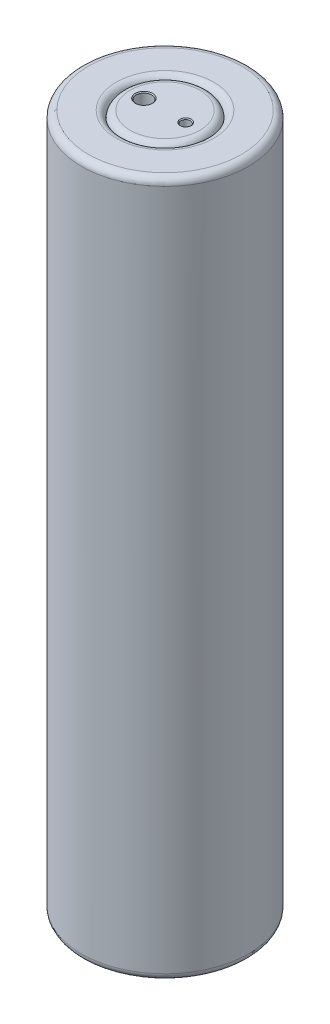
ISO-10303-21;
HEADER;
FILE_DESCRIPTION(('STEP AP214'),'2;1');
FILE_NAME('part.step','',(''),(''),'','','');
FILE_SCHEMA(('AUTOMOTIVE_DESIGN { 1 0 10303 214 1 1 1 1 }'));
ENDSEC;
DATA;
#1=APPLICATION_CONTEXT('core data for automotive mechanical design processes');
#2=APPLICATION_PROTOCOL_DEFINITION('international standard','automotive_design',2000,#1);
#3=PRODUCT_CONTEXT('',#1,'mechanical');
#4=PRODUCT('Part','Part','',(#3));
#5=PRODUCT_RELATED_PRODUCT_CATEGORY('part','',(#4));
#6=PRODUCT_DEFINITION_FORMATION('','',#4);
#7=PRODUCT_DEFINITION_CONTEXT('part definition',#1,'design');
#8=PRODUCT_DEFINITION('design','',#6,#7);
#9=PRODUCT_DEFINITION_SHAPE('','',#8);
#10=(LENGTH_UNIT() NAMED_UNIT(*) SI_UNIT(.MILLI.,.METRE.));
#11=(NAMED_UNIT(*) PLANE_ANGLE_UNIT() SI_UNIT($,.RADIAN.));
#12=(NAMED_UNIT(*) SI_UNIT($,.STERADIAN.) SOLID_ANGLE_UNIT());
#13=UNCERTAINTY_MEASURE_WITH_UNIT(LENGTH_MEASURE(1.E-05),#10,'distance_accuracy_value','');
#14=(GEOMETRIC_REPRESENTATION_CONTEXT(3) GLOBAL_UNCERTAINTY_ASSIGNED_CONTEXT((#13)) GLOBAL_UNIT_ASSIGNED_CONTEXT((#10,
#11,#12)) REPRESENTATION_CONTEXT('',''));
#15=CARTESIAN_POINT('',(0.,0.,0.));
#16=DIRECTION('',(0.,0.,1.));
#17=DIRECTION('',(1.,0.,0.));
#18=AXIS2_PLACEMENT_3D('',#15,#16,#17);
#19=CARTESIAN_POINT('',(0.,-472.667682926829,-12.834024954833));
#20=DIRECTION('',(0.,-1.,0.));
#21=DIRECTION('',(0.,0.,-1.));
#22=AXIS2_PLACEMENT_3D('',#19,#20,#21);
#23=CYLINDRICAL_SURFACE('',#22,55.9999999999999);
#24=CARTESIAN_POINT('',(0.,-467.667682926829,-12.8340249548329));
#25=DIRECTION('',(0.,-1.,0.));
#26=DIRECTION('',(0.,0.,-1.));
#27=AXIS2_PLACEMENT_3D('',#24,#25,#26);
#28=CIRCLE('',#27,56.);
#29=CARTESIAN_POINT('',(0.,-467.667682926829,-68.8340249548329));
#30=VERTEX_POINT('',#29);
#31=EDGE_CURVE('E90',#30,#30,#28,.T.);
#32=ORIENTED_EDGE('',*,*,#31,.T.);
#33=EDGE_LOOP('',(#32));
#34=FACE_BOUND('',#33,.T.);
#35=CARTESIAN_POINT('',(0.,12.3323170731707,-12.8340249548329));
#36=DIRECTION('',(0.,-1.,0.));
#37=DIRECTION('',(0.,0.,-1.));
#38=AXIS2_PLACEMENT_3D('',#35,#36,#37);
#39=CIRCLE('',#38,55.9999999999999);
#40=CARTESIAN_POINT('',(0.,12.3323170731707,-68.8340249548328));
#41=VERTEX_POINT('',#40);
#42=EDGE_CURVE('E81',#41,#41,#39,.T.);
#43=ORIENTED_EDGE('',*,*,#42,.F.);
#44=EDGE_LOOP('',(#43));
#45=FACE_BOUND('',#44,.T.);
#46=ADVANCED_FACE('F37',(#34,#45),#23,.F.);
#47=CARTESIAN_POINT('',(0.,12.3323170731707,43.1659750451671));
#48=DIRECTION('',(0.,-1.,0.));
#49=DIRECTION('',(0.,0.,-1.));
#50=AXIS2_PLACEMENT_3D('',#47,#48,#49);
#51=PLANE('',#50);
#52=ORIENTED_EDGE('',*,*,#42,.T.);
#53=EDGE_LOOP('',(#52));
#54=FACE_BOUND('',#53,.T.);
#55=CARTESIAN_POINT('',(0.,12.3323170731707,-12.8340249548329));
#56=DIRECTION('',(0.,-1.,0.));
#57=DIRECTION('',(0.,0.,-1.));
#58=AXIS2_PLACEMENT_3D('',#55,#56,#57);
#59=CIRCLE('',#58,34.);
#60=CARTESIAN_POINT('',(0.,12.3323170731707,-46.8340249548329));
#61=VERTEX_POINT('',#60);
#62=EDGE_CURVE('E84',#61,#61,#59,.T.);
#63=ORIENTED_EDGE('',*,*,#62,.F.);
#64=EDGE_LOOP('',(#63));
#65=FACE_BOUND('',#64,.T.);
#66=ADVANCED_FACE('F141',(#54,#65),#51,.T.);
#67=CARTESIAN_POINT('',(0.,-472.667682926829,-12.834024954833));
#68=DIRECTION('',(0.,-1.,0.));
#69=DIRECTION('',(0.,0.,-1.));
#70=AXIS2_PLACEMENT_3D('',#67,#68,#69);
#71=CYLINDRICAL_SURFACE('',#70,34.);
#72=ORIENTED_EDGE('',*,*,#62,.T.);
#73=EDGE_LOOP('',(#72));
#74=FACE_BOUND('',#73,.T.);
#75=CARTESIAN_POINT('',(0.,-467.667682926829,-12.8340249548329));
#76=DIRECTION('',(0.,-1.,0.));
#77=DIRECTION('',(0.,0.,-1.));
#78=AXIS2_PLACEMENT_3D('',#75,#76,#77);
#79=CIRCLE('',#78,34.);
#80=CARTESIAN_POINT('',(0.,-467.667682926829,-46.834024954833));
#81=VERTEX_POINT('',#80);
#82=EDGE_CURVE('E87',#81,#81,#79,.T.);
#83=ORIENTED_EDGE('',*,*,#82,.F.);
#84=EDGE_LOOP('',(#83));
#85=FACE_BOUND('',#84,.T.);
#86=ADVANCED_FACE('F147',(#74,#85),#71,.T.);
#87=CARTESIAN_POINT('',(0.,-467.667682926829,43.165975045167));
#88=DIRECTION('',(0.,1.,0.));
#89=DIRECTION('',(0.,0.,1.));
#90=AXIS2_PLACEMENT_3D('',#87,#88,#89);
#91=PLANE('',#90);
#92=CARTESIAN_POINT('',(-44.9995193019944,-467.667682926829,-13.042021564013));
#93=DIRECTION('',(0.,1.,0.));
#94=DIRECTION('',(0.,0.,1.));
#95=AXIS2_PLACEMENT_3D('',#92,#93,#94);
#96=CIRCLE('',#95,6.74624);
#97=CARTESIAN_POINT('',(-44.9995193019944,-467.667682926829,-6.29578156401303));
#98=VERTEX_POINT('',#97);
#99=EDGE_CURVE('E111',#98,#98,#96,.T.);
#100=ORIENTED_EDGE('',*,*,#99,.F.);
#101=EDGE_LOOP('',(#100));
#102=FACE_BOUND('',#101,.T.);
#103=ORIENTED_EDGE('',*,*,#82,.T.);
#104=EDGE_LOOP('',(#103));
#105=FACE_BOUND('',#104,.T.);
#106=ORIENTED_EDGE('',*,*,#31,.F.);
#107=EDGE_LOOP('',(#106));
#108=FACE_BOUND('',#107,.T.);
#109=ADVANCED_FACE('F230',(#102,#105,#108),#91,.T.);
#110=CARTESIAN_POINT('',(-44.9995193019944,-477.667682926829,-13.042021564013));
#111=DIRECTION('',(0.,-1.,0.));
#112=DIRECTION('',(0.,0.,-1.));
#113=AXIS2_PLACEMENT_3D('',#110,#111,#112);
#114=CYLINDRICAL_SURFACE('',#113,6.74624);
#115=CARTESIAN_POINT('',(-44.9995193019944,-477.032682926829,-13.042021564013));
#116=DIRECTION('',(0.,-1.,0.));
#117=DIRECTION('',(0.,0.,-1.));
#118=AXIS2_PLACEMENT_3D('',#115,#116,#117);
#119=CIRCLE('',#118,6.74624);
#120=CARTESIAN_POINT('',(-44.9995193019944,-477.032682926829,-19.788261564013));
#121=VERTEX_POINT('',#120);
#122=EDGE_CURVE('E114',#121,#121,#119,.T.);
#123=ORIENTED_EDGE('',*,*,#122,.T.);
#124=EDGE_LOOP('',(#123));
#125=FACE_BOUND('',#124,.T.);
#126=ORIENTED_EDGE('',*,*,#99,.T.);
#127=EDGE_LOOP('',(#126));
#128=FACE_BOUND('',#127,.T.);
#129=ADVANCED_FACE('F134',(#125,#128),#114,.F.);
#130=CARTESIAN_POINT('',(-44.9995193019944,-477.667682926829,-13.042021564013));
#131=DIRECTION('',(0.,-1.,0.));
#132=DIRECTION('',(0.,0.,-1.));
#133=AXIS2_PLACEMENT_3D('',#130,#131,#132);
#134=CONICAL_SURFACE('',#133,7.38124,0.785398163397448);
#135=ORIENTED_EDGE('',*,*,#122,.F.);
#136=EDGE_LOOP('',(#135));
#137=FACE_BOUND('',#136,.T.);
#138=CARTESIAN_POINT('',(-44.9995193019944,-477.667682926829,-13.042021564013));
#139=DIRECTION('',(0.,-1.,0.));
#140=DIRECTION('',(0.,0.,-1.));
#141=AXIS2_PLACEMENT_3D('',#138,#139,#140);
#142=CIRCLE('',#141,7.38124);
#143=CARTESIAN_POINT('',(-44.9995193019944,-477.667682926829,-20.423261564013));
#144=VERTEX_POINT('',#143);
#145=EDGE_CURVE('E117',#144,#144,#142,.T.);
#146=ORIENTED_EDGE('',*,*,#145,.T.);
#147=EDGE_LOOP('',(#146));
#148=FACE_BOUND('',#147,.T.);
#149=ADVANCED_FACE('F121',(#137,#148),#134,.F.);
#150=CARTESIAN_POINT('',(0.,-477.667682926829,47.165975045167));
#151=DIRECTION('',(0.,1.,0.));
#152=DIRECTION('',(0.,0.,1.));
#153=AXIS2_PLACEMENT_3D('',#150,#151,#152);
#154=PLANE('',#153);
#155=CARTESIAN_POINT('',(0.,-477.667682926829,-12.834024954833));
#156=DIRECTION('',(0.,1.,0.));
#157=DIRECTION('',(0.,0.,1.));
#158=AXIS2_PLACEMENT_3D('',#155,#156,#157);
#159=CIRCLE('',#158,35.);
#160=CARTESIAN_POINT('',(0.,-477.667682926829,22.165975045167));
#161=VERTEX_POINT('',#160);
#162=EDGE_CURVE('E44',#161,#161,#159,.T.);
#163=ORIENTED_EDGE('',*,*,#162,.T.);
#164=EDGE_LOOP('',(#163));
#165=FACE_BOUND('',#164,.T.);
#166=CARTESIAN_POINT('',(0.,-477.667682926829,-12.834024954833));
#167=DIRECTION('',(0.,1.,0.));
#168=DIRECTION('',(0.,0.,1.));
#169=AXIS2_PLACEMENT_3D('',#166,#167,#168);
#170=CIRCLE('',#169,54.9999999999999);
#171=CARTESIAN_POINT('',(0.,-477.667682926829,42.165975045167));
#172=VERTEX_POINT('',#171);
#173=EDGE_CURVE('E48',#172,#172,#170,.F.);
#174=ORIENTED_EDGE('',*,*,#173,.T.);
#175=EDGE_LOOP('',(#174));
#176=FACE_BOUND('',#175,.T.);
#177=ORIENTED_EDGE('',*,*,#145,.F.);
#178=EDGE_LOOP('',(#177));
#179=FACE_BOUND('',#178,.T.);
#180=ADVANCED_FACE('F123',(#165,#176,#179),#154,.F.);
#181=CARTESIAN_POINT('',(0.,-467.667682926829,-12.8340249548329));
#182=DIRECTION('',(0.,1.,0.));
#183=DIRECTION('',(0.,0.,1.));
#184=AXIS2_PLACEMENT_3D('',#181,#182,#183);
#185=PLANE('',#184);
#186=CARTESIAN_POINT('',(0.,-467.667682926829,-12.8340249548329));
#187=DIRECTION('',(0.,1.,0.));
#188=DIRECTION('',(0.,0.,1.));
#189=AXIS2_PLACEMENT_3D('',#186,#187,#188);
#190=CIRCLE('',#189,26.);
#191=CARTESIAN_POINT('',(0.,-467.667682926829,13.165975045167));
#192=VERTEX_POINT('',#191);
#193=EDGE_CURVE('E75',#192,#192,#190,.T.);
#194=ORIENTED_EDGE('',*,*,#193,.T.);
#195=EDGE_LOOP('',(#194));
#196=FACE_BOUND('',#195,.T.);
#197=ADVANCED_FACE('F125',(#196),#185,.T.);
#198=CARTESIAN_POINT('',(0.,-467.667682926829,-12.8340249548329));
#199=DIRECTION('',(0.,1.,0.));
#200=DIRECTION('',(0.,0.,1.));
#201=AXIS2_PLACEMENT_3D('',#198,#199,#200);
#202=CYLINDRICAL_SURFACE('',#201,26.);
#203=CARTESIAN_POINT('',(0.,12.3323170731707,-12.8340249548329));
#204=DIRECTION('',(0.,1.,0.));
#205=DIRECTION('',(0.,0.,1.));
#206=AXIS2_PLACEMENT_3D('',#203,#204,#205);
#207=CIRCLE('',#206,26.);
#208=CARTESIAN_POINT('',(0.,12.3323170731707,13.1659750451671));
#209=VERTEX_POINT('',#208);
#210=EDGE_CURVE('E78',#209,#209,#207,.T.);
#211=ORIENTED_EDGE('',*,*,#210,.T.);
#212=EDGE_LOOP('',(#211));
#213=FACE_BOUND('',#212,.T.);
#214=ORIENTED_EDGE('',*,*,#193,.F.);
#215=EDGE_LOOP('',(#214));
#216=FACE_BOUND('',#215,.T.);
#217=ADVANCED_FACE('F131',(#213,#216),#202,.F.);
#218=CARTESIAN_POINT('',(0.,12.3323170731707,-12.8340249548329));
#219=DIRECTION('',(0.,-1.,0.));
#220=DIRECTION('',(0.,0.,-1.));
#221=AXIS2_PLACEMENT_3D('',#218,#219,#220);
#222=PLANE('',#221);
#223=CARTESIAN_POINT('',(14.9990655702707,12.3323170731707,-12.6665973026403));
#224=DIRECTION('',(0.,-1.,0.));
#225=DIRECTION('',(0.,0.,-1.));
#226=AXIS2_PLACEMENT_3D('',#223,#224,#225);
#227=CIRCLE('',#226,3.3782);
#228=CARTESIAN_POINT('',(14.9990655702707,12.3323170731707,-16.0447973026403));
#229=VERTEX_POINT('',#228);
#230=EDGE_CURVE('E102',#229,#229,#227,.T.);
#231=ORIENTED_EDGE('',*,*,#230,.F.);
#232=EDGE_LOOP('',(#231));
#233=FACE_BOUND('',#232,.T.);
#234=CARTESIAN_POINT('',(-14.9989517782276,12.3323170731707,-12.656696010766));
#235=DIRECTION('',(0.,-1.,0.));
#236=DIRECTION('',(0.,0.,-1.));
#237=AXIS2_PLACEMENT_3D('',#234,#235,#236);
#238=CIRCLE('',#237,5.5626);
#239=CARTESIAN_POINT('',(-14.9989517782276,12.3323170731707,-18.219296010766));
#240=VERTEX_POINT('',#239);
#241=EDGE_CURVE('E93',#240,#240,#238,.T.);
#242=ORIENTED_EDGE('',*,*,#241,.F.);
#243=EDGE_LOOP('',(#242));
#244=FACE_BOUND('',#243,.T.);
#245=ORIENTED_EDGE('',*,*,#210,.F.);
#246=EDGE_LOOP('',(#245));
#247=FACE_BOUND('',#246,.T.);
#248=ADVANCED_FACE('F192',(#233,#244,#247),#222,.T.);
#249=CARTESIAN_POINT('',(-14.9989517782276,22.3323170731707,-12.656696010766));
#250=DIRECTION('',(0.,1.,0.));
#251=DIRECTION('',(0.,0.,1.));
#252=AXIS2_PLACEMENT_3D('',#249,#250,#251);
#253=CYLINDRICAL_SURFACE('',#252,5.5626);
#254=CARTESIAN_POINT('',(-14.9989517782276,21.6973170731707,-12.656696010766));
#255=DIRECTION('',(0.,1.,0.));
#256=DIRECTION('',(0.,0.,1.));
#257=AXIS2_PLACEMENT_3D('',#254,#255,#256);
#258=CIRCLE('',#257,5.5626);
#259=CARTESIAN_POINT('',(-14.9989517782276,21.6973170731707,-7.09409601076597));
#260=VERTEX_POINT('',#259);
#261=EDGE_CURVE('E96',#260,#260,#258,.T.);
#262=ORIENTED_EDGE('',*,*,#261,.T.);
#263=EDGE_LOOP('',(#262));
#264=FACE_BOUND('',#263,.T.);
#265=ORIENTED_EDGE('',*,*,#241,.T.);
#266=EDGE_LOOP('',(#265));
#267=FACE_BOUND('',#266,.T.);
#268=ADVANCED_FACE('F196',(#264,#267),#253,.F.);
#269=CARTESIAN_POINT('',(-14.9989517782276,22.3323170731707,-12.656696010766));
#270=DIRECTION('',(0.,1.,0.));
#271=DIRECTION('',(0.,0.,1.));
#272=AXIS2_PLACEMENT_3D('',#269,#270,#271);
#273=CONICAL_SURFACE('',#272,6.1976,0.785398163397451);
#274=ORIENTED_EDGE('',*,*,#261,.F.);
#275=EDGE_LOOP('',(#274));
#276=FACE_BOUND('',#275,.T.);
#277=CARTESIAN_POINT('',(-14.9989517782276,22.3323170731707,-12.656696010766));
#278=DIRECTION('',(0.,1.,0.));
#279=DIRECTION('',(0.,0.,1.));
#280=AXIS2_PLACEMENT_3D('',#277,#278,#279);
#281=CIRCLE('',#280,6.1976);
#282=CARTESIAN_POINT('',(-14.9989517782276,22.3323170731707,-6.45909601076597));
#283=VERTEX_POINT('',#282);
#284=EDGE_CURVE('E99',#283,#283,#281,.T.);
#285=ORIENTED_EDGE('',*,*,#284,.T.);
#286=EDGE_LOOP('',(#285));
#287=FACE_BOUND('',#286,.T.);
#288=ADVANCED_FACE('F199',(#276,#287),#273,.F.);
#289=CARTESIAN_POINT('',(0.,22.3323170731707,17.1659750451671));
#290=DIRECTION('',(0.,1.,0.));
#291=DIRECTION('',(0.,0.,1.));
#292=AXIS2_PLACEMENT_3D('',#289,#290,#291);
#293=PLANE('',#292);
#294=CARTESIAN_POINT('',(14.9990655702707,22.3323170731707,-12.6665973026403));
#295=DIRECTION('',(0.,1.,0.));
#296=DIRECTION('',(0.,0.,1.));
#297=AXIS2_PLACEMENT_3D('',#294,#295,#296);
#298=CIRCLE('',#297,4.0132);
#299=CARTESIAN_POINT('',(14.9990655702707,22.3323170731707,-8.65339730264028));
#300=VERTEX_POINT('',#299);
#301=EDGE_CURVE('E108',#300,#300,#298,.T.);
#302=ORIENTED_EDGE('',*,*,#301,.F.);
#303=EDGE_LOOP('',(#302));
#304=FACE_BOUND('',#303,.T.);
#305=ORIENTED_EDGE('',*,*,#284,.F.);
#306=EDGE_LOOP('',(#305));
#307=FACE_BOUND('',#306,.T.);
#308=CARTESIAN_POINT('',(0.,22.3323170731707,-12.8340249548329));
#309=DIRECTION('',(0.,1.,0.));
#310=DIRECTION('',(0.,0.,1.));
#311=AXIS2_PLACEMENT_3D('',#308,#309,#310);
#312=CIRCLE('',#311,25.);
#313=CARTESIAN_POINT('',(0.,22.3323170731707,12.1659750451671));
#314=VERTEX_POINT('',#313);
#315=EDGE_CURVE('E72',#314,#314,#312,.T.);
#316=ORIENTED_EDGE('',*,*,#315,.T.);
#317=EDGE_LOOP('',(#316));
#318=FACE_BOUND('',#317,.T.);
#319=ADVANCED_FACE('F187',(#304,#307,#318),#293,.T.);
#320=CARTESIAN_POINT('',(0.,17.3323170731707,-12.8340249548329));
#321=DIRECTION('',(0.,1.,0.));
#322=DIRECTION('',(0.,0.,1.));
#323=AXIS2_PLACEMENT_3D('',#320,#321,#322);
#324=TOROIDAL_SURFACE('',#323,25.,5.);
#325=CARTESIAN_POINT('',(0.,17.3323170731707,-12.8340249548329));
#326=DIRECTION('',(0.,1.,0.));
#327=DIRECTION('',(0.,0.,1.));
#328=AXIS2_PLACEMENT_3D('',#325,#326,#327);
#329=CIRCLE('',#328,30.);
#330=CARTESIAN_POINT('',(0.,17.3323170731707,17.1659750451671));
#331=VERTEX_POINT('',#330);
#332=EDGE_CURVE('E69',#331,#331,#329,.F.);
#333=ORIENTED_EDGE('',*,*,#332,.F.);
#334=EDGE_LOOP('',(#333));
#335=FACE_BOUND('',#334,.T.);
#336=ORIENTED_EDGE('',*,*,#315,.F.);
#337=EDGE_LOOP('',(#336));
#338=FACE_BOUND('',#337,.T.);
#339=ADVANCED_FACE('F164',(#335,#338),#324,.T.);
#340=CARTESIAN_POINT('',(0.,-472.667682926829,-12.834024954833));
#341=DIRECTION('',(0.,-1.,0.));
#342=DIRECTION('',(0.,0.,-1.));
#343=AXIS2_PLACEMENT_3D('',#340,#341,#342);
#344=CYLINDRICAL_SURFACE('',#343,59.9999999999999);
#345=CARTESIAN_POINT('',(0.,-472.667682926829,-12.834024954833));
#346=DIRECTION('',(0.,1.,0.));
#347=DIRECTION('',(0.,0.,1.));
#348=AXIS2_PLACEMENT_3D('',#345,#346,#347);
#349=CIRCLE('',#348,59.9999999999999);
#350=CARTESIAN_POINT('',(0.,-472.667682926829,47.165975045167));
#351=VERTEX_POINT('',#350);
#352=EDGE_CURVE('E10',#351,#351,#349,.T.);
#353=ORIENTED_EDGE('',*,*,#352,.T.);
#354=EDGE_LOOP('',(#353));
#355=FACE_BOUND('',#354,.T.);
#356=CARTESIAN_POINT('',(0.,17.3323170731707,-12.8340249548329));
#357=DIRECTION('',(0.,-1.,0.));
#358=DIRECTION('',(0.,0.,-1.));
#359=AXIS2_PLACEMENT_3D('',#356,#357,#358);
#360=CIRCLE('',#359,59.9999999999999);
#361=CARTESIAN_POINT('',(0.,17.3323170731707,-72.8340249548328));
#362=VERTEX_POINT('',#361);
#363=EDGE_CURVE('E60',#362,#362,#360,.T.);
#364=ORIENTED_EDGE('',*,*,#363,.T.);
#365=EDGE_LOOP('',(#364));
#366=FACE_BOUND('',#365,.T.);
#367=ADVANCED_FACE('F155',(#355,#366),#344,.T.);
#368=CARTESIAN_POINT('',(0.,22.3323170731707,47.1659750451671));
#369=DIRECTION('',(0.,-1.,0.));
#370=DIRECTION('',(0.,0.,-1.));
#371=AXIS2_PLACEMENT_3D('',#368,#369,#370);
#372=PLANE('',#371);
#373=CARTESIAN_POINT('',(0.,22.3323170731707,-12.8340249548329));
#374=DIRECTION('',(0.,-1.,0.));
#375=DIRECTION('',(0.,0.,-1.));
#376=AXIS2_PLACEMENT_3D('',#373,#374,#375);
#377=CIRCLE('',#376,54.9999999999999);
#378=CARTESIAN_POINT('',(0.,22.3323170731707,-67.8340249548328));
#379=VERTEX_POINT('',#378);
#380=EDGE_CURVE('E52',#379,#379,#377,.F.);
#381=ORIENTED_EDGE('',*,*,#380,.T.);
#382=EDGE_LOOP('',(#381));
#383=FACE_BOUND('',#382,.T.);
#384=CARTESIAN_POINT('',(0.,22.3323170731707,-12.8340249548329));
#385=DIRECTION('',(0.,-1.,0.));
#386=DIRECTION('',(0.,0.,-1.));
#387=AXIS2_PLACEMENT_3D('',#384,#385,#386);
#388=CIRCLE('',#387,35.);
#389=CARTESIAN_POINT('',(0.,22.3323170731707,-47.8340249548329));
#390=VERTEX_POINT('',#389);
#391=EDGE_CURVE('E57',#390,#390,#388,.T.);
#392=ORIENTED_EDGE('',*,*,#391,.T.);
#393=EDGE_LOOP('',(#392));
#394=FACE_BOUND('',#393,.T.);
#395=ADVANCED_FACE('F152',(#383,#394),#372,.F.);
#396=CARTESIAN_POINT('',(0.,-477.667682926829,17.165975045167));
#397=DIRECTION('',(0.,-1.,0.));
#398=DIRECTION('',(0.,0.,-1.));
#399=AXIS2_PLACEMENT_3D('',#396,#397,#398);
#400=PLANE('',#399);
#401=CARTESIAN_POINT('',(0.,-477.667682926829,-12.8340249548329));
#402=DIRECTION('',(0.,-1.,0.));
#403=DIRECTION('',(0.,0.,-1.));
#404=AXIS2_PLACEMENT_3D('',#401,#402,#403);
#405=CIRCLE('',#404,25.);
#406=CARTESIAN_POINT('',(0.,-477.667682926829,-37.8340249548329));
#407=VERTEX_POINT('',#406);
#408=EDGE_CURVE('E63',#407,#407,#405,.T.);
#409=ORIENTED_EDGE('',*,*,#408,.T.);
#410=EDGE_LOOP('',(#409));
#411=FACE_BOUND('',#410,.T.);
#412=ADVANCED_FACE('F154',(#411),#400,.T.);
#413=CARTESIAN_POINT('',(0.,-472.667682926829,-12.8340249548329));
#414=DIRECTION('',(0.,-1.,0.));
#415=DIRECTION('',(0.,0.,-1.));
#416=AXIS2_PLACEMENT_3D('',#413,#414,#415);
#417=TOROIDAL_SURFACE('',#416,25.,5.);
#418=ORIENTED_EDGE('',*,*,#408,.F.);
#419=EDGE_LOOP('',(#418));
#420=FACE_BOUND('',#419,.T.);
#421=CARTESIAN_POINT('',(0.,-472.667682926829,-12.8340249548329));
#422=DIRECTION('',(0.,-1.,0.));
#423=DIRECTION('',(0.,0.,-1.));
#424=AXIS2_PLACEMENT_3D('',#421,#422,#423);
#425=CIRCLE('',#424,30.);
#426=CARTESIAN_POINT('',(0.,-472.667682926829,-42.8340249548329));
#427=VERTEX_POINT('',#426);
#428=EDGE_CURVE('E66',#427,#427,#425,.F.);
#429=ORIENTED_EDGE('',*,*,#428,.F.);
#430=EDGE_LOOP('',(#429));
#431=FACE_BOUND('',#430,.T.);
#432=ADVANCED_FACE('F161',(#420,#431),#417,.T.);
#433=CARTESIAN_POINT('',(0.,17.3323170731707,-12.8340249548329));
#434=DIRECTION('',(0.,-1.,0.));
#435=DIRECTION('',(0.,0.,-1.));
#436=AXIS2_PLACEMENT_3D('',#433,#434,#435);
#437=TOROIDAL_SURFACE('',#436,54.9999999999999,5.);
#438=ORIENTED_EDGE('',*,*,#380,.F.);
#439=EDGE_LOOP('',(#438));
#440=FACE_BOUND('',#439,.T.);
#441=ORIENTED_EDGE('',*,*,#363,.F.);
#442=EDGE_LOOP('',(#441));
#443=FACE_BOUND('',#442,.T.);
#444=ADVANCED_FACE('F172',(#440,#443),#437,.T.);
#445=CARTESIAN_POINT('',(0.,17.3323170731707,-12.8340249548329));
#446=DIRECTION('',(0.,-1.,0.));
#447=DIRECTION('',(0.,0.,-1.));
#448=AXIS2_PLACEMENT_3D('',#445,#446,#447);
#449=TOROIDAL_SURFACE('',#448,35.,5.);
#450=ORIENTED_EDGE('',*,*,#332,.T.);
#451=EDGE_LOOP('',(#450));
#452=FACE_BOUND('',#451,.T.);
#453=ORIENTED_EDGE('',*,*,#391,.F.);
#454=EDGE_LOOP('',(#453));
#455=FACE_BOUND('',#454,.T.);
#456=ADVANCED_FACE('F169',(#452,#455),#449,.T.);
#457=CARTESIAN_POINT('',(0.,-472.667682926829,-12.834024954833));
#458=DIRECTION('',(0.,1.,0.));
#459=DIRECTION('',(0.,0.,1.));
#460=AXIS2_PLACEMENT_3D('',#457,#458,#459);
#461=TOROIDAL_SURFACE('',#460,35.,5.);
#462=ORIENTED_EDGE('',*,*,#162,.F.);
#463=EDGE_LOOP('',(#462));
#464=FACE_BOUND('',#463,.T.);
#465=ORIENTED_EDGE('',*,*,#428,.T.);
#466=EDGE_LOOP('',(#465));
#467=FACE_BOUND('',#466,.T.);
#468=ADVANCED_FACE('F171',(#464,#467),#461,.T.);
#469=CARTESIAN_POINT('',(0.,-472.667682926829,-12.834024954833));
#470=DIRECTION('',(0.,1.,0.));
#471=DIRECTION('',(0.,0.,1.));
#472=AXIS2_PLACEMENT_3D('',#469,#470,#471);
#473=TOROIDAL_SURFACE('',#472,54.9999999999999,5.);
#474=ORIENTED_EDGE('',*,*,#352,.F.);
#475=EDGE_LOOP('',(#474));
#476=FACE_BOUND('',#475,.T.);
#477=ORIENTED_EDGE('',*,*,#173,.F.);
#478=EDGE_LOOP('',(#477));
#479=FACE_BOUND('',#478,.T.);
#480=ADVANCED_FACE('F39',(#476,#479),#473,.T.);
#481=CARTESIAN_POINT('',(14.9990655702707,22.3323170731707,-12.6665973026403));
#482=DIRECTION('',(0.,1.,0.));
#483=DIRECTION('',(0.,0.,1.));
#484=AXIS2_PLACEMENT_3D('',#481,#482,#483);
#485=CYLINDRICAL_SURFACE('',#484,3.3782);
#486=CARTESIAN_POINT('',(14.9990655702707,21.6973170731707,-12.6665973026403));
#487=DIRECTION('',(0.,1.,0.));
#488=DIRECTION('',(0.,0.,1.));
#489=AXIS2_PLACEMENT_3D('',#486,#487,#488);
#490=CIRCLE('',#489,3.3782);
#491=CARTESIAN_POINT('',(14.9990655702707,21.6973170731707,-9.28839730264029));
#492=VERTEX_POINT('',#491);
#493=EDGE_CURVE('E105',#492,#492,#490,.T.);
#494=ORIENTED_EDGE('',*,*,#493,.T.);
#495=EDGE_LOOP('',(#494));
#496=FACE_BOUND('',#495,.T.);
#497=ORIENTED_EDGE('',*,*,#230,.T.);
#498=EDGE_LOOP('',(#497));
#499=FACE_BOUND('',#498,.T.);
#500=ADVANCED_FACE('F216',(#496,#499),#485,.F.);
#501=CARTESIAN_POINT('',(14.9990655702707,22.3323170731707,-12.6665973026403));
#502=DIRECTION('',(0.,1.,0.));
#503=DIRECTION('',(0.,0.,1.));
#504=AXIS2_PLACEMENT_3D('',#501,#502,#503);
#505=CONICAL_SURFACE('',#504,4.0132,0.785398163397451);
#506=ORIENTED_EDGE('',*,*,#493,.F.);
#507=EDGE_LOOP('',(#506));
#508=FACE_BOUND('',#507,.T.);
#509=ORIENTED_EDGE('',*,*,#301,.T.);
#510=EDGE_LOOP('',(#509));
#511=FACE_BOUND('',#510,.T.);
#512=ADVANCED_FACE('F214',(#508,#511),#505,.F.);
#513=CLOSED_SHELL('',(#46,#66,#86,#109,#129,#149,#180,#197,#217,#248,#268,#288,#319,#339,#367,
#395,#412,#432,#444,#456,#468,#480,#500,#512));
#514=MANIFOLD_SOLID_BREP('B2',#513);
#515=ADVANCED_BREP_SHAPE_REPRESENTATION('',(#18,#514),#14);
#516=SHAPE_DEFINITION_REPRESENTATION(#9,#515);
ENDSEC;
END-ISO-10303-21;
